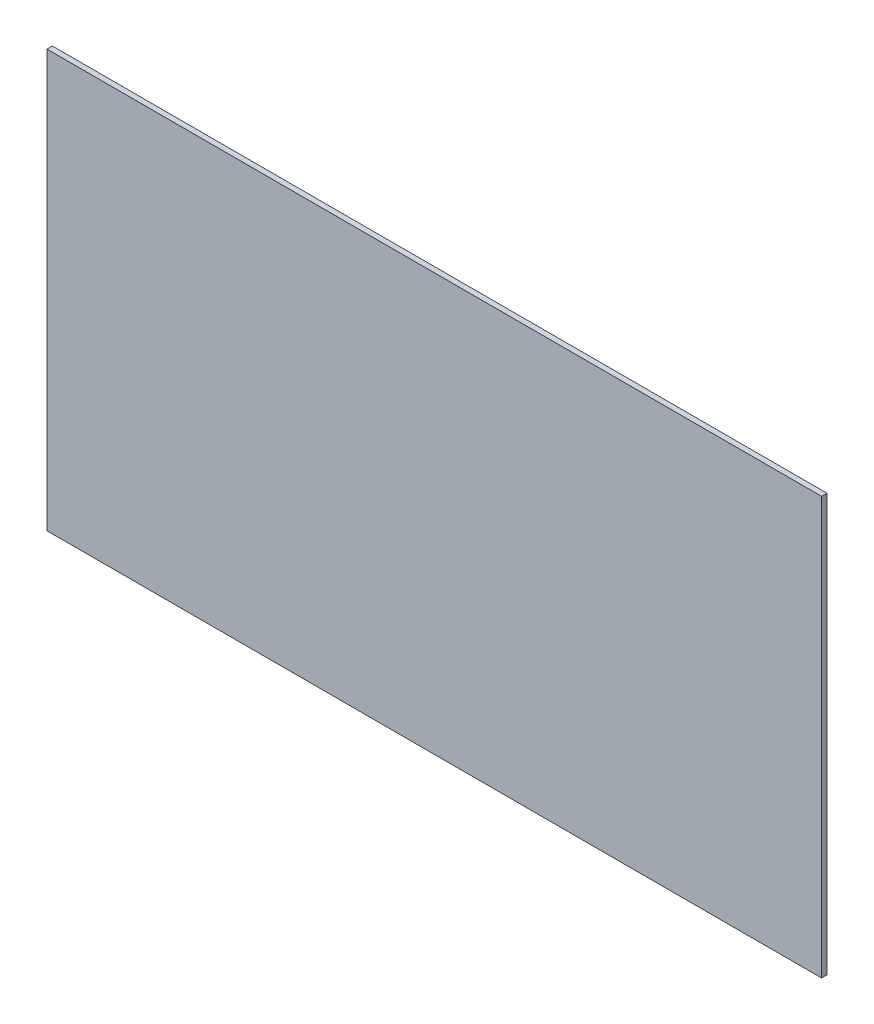
ISO-10303-21;
HEADER;
FILE_DESCRIPTION(('STEP AP214'),'2;1');
FILE_NAME('part.step','',(''),(''),'','','');
FILE_SCHEMA(('AUTOMOTIVE_DESIGN { 1 0 10303 214 1 1 1 1 }'));
ENDSEC;
DATA;
#1=APPLICATION_CONTEXT('core data for automotive mechanical design processes');
#2=APPLICATION_PROTOCOL_DEFINITION('international standard','automotive_design',2000,#1);
#3=PRODUCT_CONTEXT('',#1,'mechanical');
#4=PRODUCT('Part','Part','',(#3));
#5=PRODUCT_RELATED_PRODUCT_CATEGORY('part','',(#4));
#6=PRODUCT_DEFINITION_FORMATION('','',#4);
#7=PRODUCT_DEFINITION_CONTEXT('part definition',#1,'design');
#8=PRODUCT_DEFINITION('design','',#6,#7);
#9=PRODUCT_DEFINITION_SHAPE('','',#8);
#10=(LENGTH_UNIT() NAMED_UNIT(*) SI_UNIT(.MILLI.,.METRE.));
#11=(NAMED_UNIT(*) PLANE_ANGLE_UNIT() SI_UNIT($,.RADIAN.));
#12=(NAMED_UNIT(*) SI_UNIT($,.STERADIAN.) SOLID_ANGLE_UNIT());
#13=UNCERTAINTY_MEASURE_WITH_UNIT(LENGTH_MEASURE(1.E-05),#10,'distance_accuracy_value','');
#14=(GEOMETRIC_REPRESENTATION_CONTEXT(3) GLOBAL_UNCERTAINTY_ASSIGNED_CONTEXT((#13)) GLOBAL_UNIT_ASSIGNED_CONTEXT((#10,
#11,#12)) REPRESENTATION_CONTEXT('',''));
#15=CARTESIAN_POINT('',(0.,0.,0.));
#16=DIRECTION('',(0.,0.,1.));
#17=DIRECTION('',(1.,0.,0.));
#18=AXIS2_PLACEMENT_3D('',#15,#16,#17);
#19=CARTESIAN_POINT('',(0.,0.,12.7));
#20=DIRECTION('',(0.,1.,0.));
#21=DIRECTION('',(0.,0.,1.));
#22=AXIS2_PLACEMENT_3D('',#19,#20,#21);
#23=PLANE('',#22);
#24=DIRECTION('',(1.,0.,0.));
#25=VECTOR('',#24,1.);
#26=CARTESIAN_POINT('',(0.,0.,0.));
#27=LINE('',#26,#25);
#28=CARTESIAN_POINT('',(0.,0.,0.));
#29=VERTEX_POINT('',#28);
#30=CARTESIAN_POINT('',(1816.1,0.,0.));
#31=VERTEX_POINT('',#30);
#32=EDGE_CURVE('E96',#29,#31,#27,.T.);
#33=ORIENTED_EDGE('',*,*,#32,.T.);
#34=DIRECTION('',(0.,0.,-1.));
#35=VECTOR('',#34,1.);
#36=CARTESIAN_POINT('',(1816.1,0.,12.7));
#37=LINE('',#36,#35);
#38=CARTESIAN_POINT('',(1816.1,0.,12.7));
#39=VERTEX_POINT('',#38);
#40=EDGE_CURVE('E11',#39,#31,#37,.T.);
#41=ORIENTED_EDGE('',*,*,#40,.F.);
#42=DIRECTION('',(1.,0.,0.));
#43=VECTOR('',#42,1.);
#44=CARTESIAN_POINT('',(0.,0.,12.7));
#45=LINE('',#44,#43);
#46=CARTESIAN_POINT('',(0.,0.,12.7));
#47=VERTEX_POINT('',#46);
#48=EDGE_CURVE('E82',#47,#39,#45,.T.);
#49=ORIENTED_EDGE('',*,*,#48,.F.);
#50=DIRECTION('',(0.,0.,-1.));
#51=VECTOR('',#50,1.);
#52=CARTESIAN_POINT('',(0.,0.,12.7));
#53=LINE('',#52,#51);
#54=EDGE_CURVE('E49',#47,#29,#53,.T.);
#55=ORIENTED_EDGE('',*,*,#54,.T.);
#56=EDGE_LOOP('',(#33,#41,#49,#55));
#57=FACE_BOUND('',#56,.T.);
#58=ADVANCED_FACE('F33',(#57),#23,.F.);
#59=CARTESIAN_POINT('',(1816.1,0.,12.7));
#60=DIRECTION('',(-1.,0.,0.));
#61=DIRECTION('',(0.,0.,1.));
#62=AXIS2_PLACEMENT_3D('',#59,#60,#61);
#63=PLANE('',#62);
#64=DIRECTION('',(0.,1.,0.));
#65=VECTOR('',#64,1.);
#66=CARTESIAN_POINT('',(1816.1,0.,0.));
#67=LINE('',#66,#65);
#68=CARTESIAN_POINT('',(1816.1,977.9,0.));
#69=VERTEX_POINT('',#68);
#70=EDGE_CURVE('E87',#31,#69,#67,.T.);
#71=ORIENTED_EDGE('',*,*,#70,.T.);
#72=DIRECTION('',(0.,0.,-1.));
#73=VECTOR('',#72,1.);
#74=CARTESIAN_POINT('',(1816.1,977.9,12.7));
#75=LINE('',#74,#73);
#76=CARTESIAN_POINT('',(1816.1,977.9,12.7));
#77=VERTEX_POINT('',#76);
#78=EDGE_CURVE('E41',#77,#69,#75,.T.);
#79=ORIENTED_EDGE('',*,*,#78,.F.);
#80=DIRECTION('',(0.,1.,0.));
#81=VECTOR('',#80,1.);
#82=CARTESIAN_POINT('',(1816.1,0.,12.7));
#83=LINE('',#82,#81);
#84=EDGE_CURVE('E74',#39,#77,#83,.T.);
#85=ORIENTED_EDGE('',*,*,#84,.F.);
#86=ORIENTED_EDGE('',*,*,#40,.T.);
#87=EDGE_LOOP('',(#71,#79,#85,#86));
#88=FACE_BOUND('',#87,.T.);
#89=ADVANCED_FACE('F86',(#88),#63,.F.);
#90=CARTESIAN_POINT('',(0.,977.9,12.7));
#91=DIRECTION('',(0.,1.,0.));
#92=DIRECTION('',(0.,0.,1.));
#93=AXIS2_PLACEMENT_3D('',#90,#91,#92);
#94=PLANE('',#93);
#95=DIRECTION('',(1.,0.,0.));
#96=VECTOR('',#95,1.);
#97=CARTESIAN_POINT('',(0.,977.9,0.));
#98=LINE('',#97,#96);
#99=CARTESIAN_POINT('',(0.,977.9,0.));
#100=VERTEX_POINT('',#99);
#101=EDGE_CURVE('E99',#100,#69,#98,.T.);
#102=ORIENTED_EDGE('',*,*,#101,.F.);
#103=DIRECTION('',(0.,0.,-1.));
#104=VECTOR('',#103,1.);
#105=CARTESIAN_POINT('',(0.,977.9,12.7));
#106=LINE('',#105,#104);
#107=CARTESIAN_POINT('',(0.,977.9,12.7));
#108=VERTEX_POINT('',#107);
#109=EDGE_CURVE('E63',#108,#100,#106,.T.);
#110=ORIENTED_EDGE('',*,*,#109,.F.);
#111=DIRECTION('',(1.,0.,0.));
#112=VECTOR('',#111,1.);
#113=CARTESIAN_POINT('',(0.,977.9,12.7));
#114=LINE('',#113,#112);
#115=EDGE_CURVE('E81',#108,#77,#114,.T.);
#116=ORIENTED_EDGE('',*,*,#115,.T.);
#117=ORIENTED_EDGE('',*,*,#78,.T.);
#118=EDGE_LOOP('',(#102,#110,#116,#117));
#119=FACE_BOUND('',#118,.T.);
#120=ADVANCED_FACE('F90',(#119),#94,.T.);
#121=CARTESIAN_POINT('',(0.,0.,12.7));
#122=DIRECTION('',(-1.,0.,0.));
#123=DIRECTION('',(0.,0.,1.));
#124=AXIS2_PLACEMENT_3D('',#121,#122,#123);
#125=PLANE('',#124);
#126=DIRECTION('',(0.,1.,0.));
#127=VECTOR('',#126,1.);
#128=CARTESIAN_POINT('',(0.,0.,0.));
#129=LINE('',#128,#127);
#130=EDGE_CURVE('E101',#29,#100,#129,.T.);
#131=ORIENTED_EDGE('',*,*,#130,.F.);
#132=ORIENTED_EDGE('',*,*,#54,.F.);
#133=DIRECTION('',(0.,1.,0.));
#134=VECTOR('',#133,1.);
#135=CARTESIAN_POINT('',(0.,0.,12.7));
#136=LINE('',#135,#134);
#137=EDGE_CURVE('E91',#47,#108,#136,.T.);
#138=ORIENTED_EDGE('',*,*,#137,.T.);
#139=ORIENTED_EDGE('',*,*,#109,.T.);
#140=EDGE_LOOP('',(#131,#132,#138,#139));
#141=FACE_BOUND('',#140,.T.);
#142=ADVANCED_FACE('F107',(#141),#125,.T.);
#143=CARTESIAN_POINT('',(0.,0.,12.7));
#144=DIRECTION('',(0.,0.,1.));
#145=DIRECTION('',(1.,0.,0.));
#146=AXIS2_PLACEMENT_3D('',#143,#144,#145);
#147=PLANE('',#146);
#148=ORIENTED_EDGE('',*,*,#48,.T.);
#149=ORIENTED_EDGE('',*,*,#84,.T.);
#150=ORIENTED_EDGE('',*,*,#115,.F.);
#151=ORIENTED_EDGE('',*,*,#137,.F.);
#152=EDGE_LOOP('',(#148,#149,#150,#151));
#153=FACE_BOUND('',#152,.T.);
#154=ADVANCED_FACE('F78',(#153),#147,.T.);
#155=CARTESIAN_POINT('',(0.,0.,0.));
#156=DIRECTION('',(0.,0.,1.));
#157=DIRECTION('',(1.,0.,0.));
#158=AXIS2_PLACEMENT_3D('',#155,#156,#157);
#159=PLANE('',#158);
#160=ORIENTED_EDGE('',*,*,#32,.F.);
#161=ORIENTED_EDGE('',*,*,#130,.T.);
#162=ORIENTED_EDGE('',*,*,#101,.T.);
#163=ORIENTED_EDGE('',*,*,#70,.F.);
#164=EDGE_LOOP('',(#160,#161,#162,#163));
#165=FACE_BOUND('',#164,.T.);
#166=ADVANCED_FACE('F106',(#165),#159,.F.);
#167=CLOSED_SHELL('',(#58,#89,#120,#142,#154,#166));
#168=MANIFOLD_SOLID_BREP('B2',#167);
#169=ADVANCED_BREP_SHAPE_REPRESENTATION('',(#18,#168),#14);
#170=SHAPE_DEFINITION_REPRESENTATION(#9,#169);
ENDSEC;
END-ISO-10303-21;
